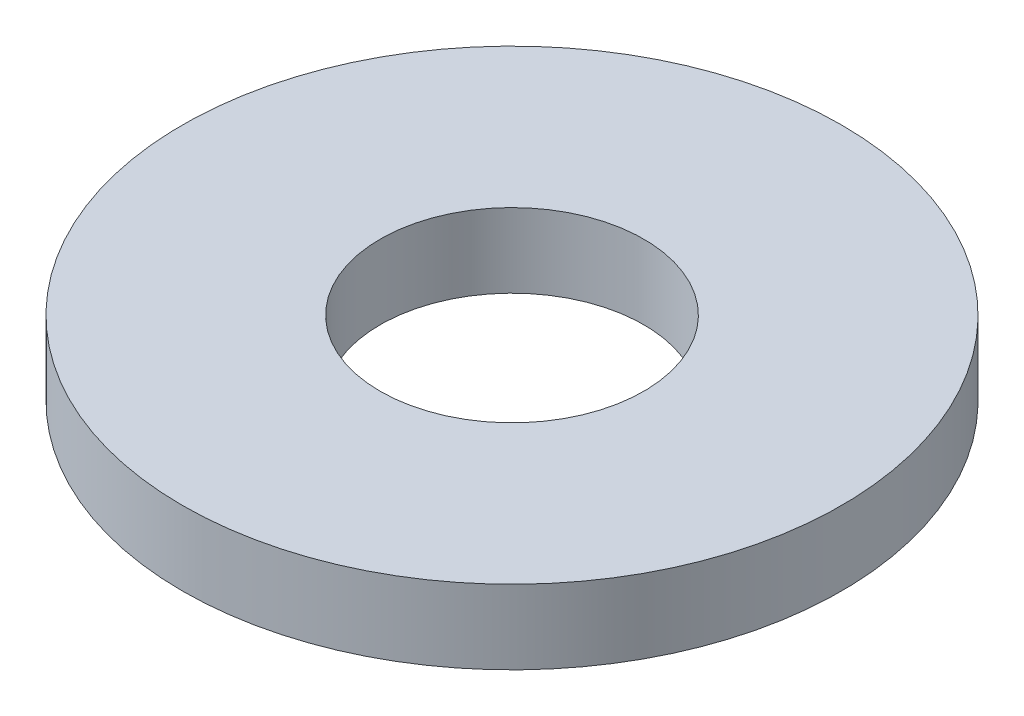
ISO-10303-21;
HEADER;
FILE_DESCRIPTION(('STEP AP214'),'2;1');
FILE_NAME('part.step','',(''),(''),'','','');
FILE_SCHEMA(('AUTOMOTIVE_DESIGN { 1 0 10303 214 1 1 1 1 }'));
ENDSEC;
DATA;
#1=APPLICATION_CONTEXT('core data for automotive mechanical design processes');
#2=APPLICATION_PROTOCOL_DEFINITION('international standard','automotive_design',2000,#1);
#3=PRODUCT_CONTEXT('',#1,'mechanical');
#4=PRODUCT('Part','Part','',(#3));
#5=PRODUCT_RELATED_PRODUCT_CATEGORY('part','',(#4));
#6=PRODUCT_DEFINITION_FORMATION('','',#4);
#7=PRODUCT_DEFINITION_CONTEXT('part definition',#1,'design');
#8=PRODUCT_DEFINITION('design','',#6,#7);
#9=PRODUCT_DEFINITION_SHAPE('','',#8);
#10=(LENGTH_UNIT() NAMED_UNIT(*) SI_UNIT(.MILLI.,.METRE.));
#11=(NAMED_UNIT(*) PLANE_ANGLE_UNIT() SI_UNIT($,.RADIAN.));
#12=(NAMED_UNIT(*) SI_UNIT($,.STERADIAN.) SOLID_ANGLE_UNIT());
#13=UNCERTAINTY_MEASURE_WITH_UNIT(LENGTH_MEASURE(1.E-05),#10,'distance_accuracy_value','');
#14=(GEOMETRIC_REPRESENTATION_CONTEXT(3) GLOBAL_UNCERTAINTY_ASSIGNED_CONTEXT((#13)) GLOBAL_UNIT_ASSIGNED_CONTEXT((#10,
#11,#12)) REPRESENTATION_CONTEXT('',''));
#15=CARTESIAN_POINT('',(0.,0.,0.));
#16=DIRECTION('',(0.,0.,1.));
#17=DIRECTION('',(1.,0.,0.));
#18=AXIS2_PLACEMENT_3D('',#15,#16,#17);
#19=CARTESIAN_POINT('',(0.,0.9,0.));
#20=DIRECTION('',(0.,-1.,0.));
#21=DIRECTION('',(0.,0.,-1.));
#22=AXIS2_PLACEMENT_3D('',#19,#20,#21);
#23=CYLINDRICAL_SURFACE('',#22,4.);
#24=CARTESIAN_POINT('',(0.,0.9,0.));
#25=DIRECTION('',(0.,1.,0.));
#26=DIRECTION('',(0.,0.,1.));
#27=AXIS2_PLACEMENT_3D('',#24,#25,#26);
#28=CIRCLE('',#27,4.);
#29=CARTESIAN_POINT('',(0.,0.9,4.));
#30=VERTEX_POINT('',#29);
#31=EDGE_CURVE('E10',#30,#30,#28,.T.);
#32=ORIENTED_EDGE('',*,*,#31,.F.);
#33=EDGE_LOOP('',(#32));
#34=FACE_BOUND('',#33,.T.);
#35=CARTESIAN_POINT('',(0.,0.,0.));
#36=DIRECTION('',(0.,1.,0.));
#37=DIRECTION('',(0.,0.,1.));
#38=AXIS2_PLACEMENT_3D('',#35,#36,#37);
#39=CIRCLE('',#38,4.);
#40=CARTESIAN_POINT('',(0.,0.,4.));
#41=VERTEX_POINT('',#40);
#42=EDGE_CURVE('E37',#41,#41,#39,.T.);
#43=ORIENTED_EDGE('',*,*,#42,.T.);
#44=EDGE_LOOP('',(#43));
#45=FACE_BOUND('',#44,.T.);
#46=ADVANCED_FACE('F34',(#34,#45),#23,.T.);
#47=CARTESIAN_POINT('',(0.,0.9,0.));
#48=DIRECTION('',(0.,1.,0.));
#49=DIRECTION('',(0.,0.,1.));
#50=AXIS2_PLACEMENT_3D('',#47,#48,#49);
#51=PLANE('',#50);
#52=CARTESIAN_POINT('',(0.,0.9,0.));
#53=DIRECTION('',(0.,1.,0.));
#54=DIRECTION('',(0.,0.,1.));
#55=AXIS2_PLACEMENT_3D('',#52,#53,#54);
#56=CIRCLE('',#55,1.6);
#57=CARTESIAN_POINT('',(0.,0.9,1.6));
#58=VERTEX_POINT('',#57);
#59=EDGE_CURVE('E46',#58,#58,#56,.T.);
#60=ORIENTED_EDGE('',*,*,#59,.F.);
#61=EDGE_LOOP('',(#60));
#62=FACE_BOUND('',#61,.T.);
#63=ORIENTED_EDGE('',*,*,#31,.T.);
#64=EDGE_LOOP('',(#63));
#65=FACE_BOUND('',#64,.T.);
#66=ADVANCED_FACE('F61',(#62,#65),#51,.T.);
#67=CARTESIAN_POINT('',(0.,0.,0.));
#68=DIRECTION('',(0.,1.,0.));
#69=DIRECTION('',(0.,0.,1.));
#70=AXIS2_PLACEMENT_3D('',#67,#68,#69);
#71=PLANE('',#70);
#72=CARTESIAN_POINT('',(0.,0.,0.));
#73=DIRECTION('',(0.,1.,0.));
#74=DIRECTION('',(0.,0.,1.));
#75=AXIS2_PLACEMENT_3D('',#72,#73,#74);
#76=CIRCLE('',#75,1.6);
#77=CARTESIAN_POINT('',(0.,0.,1.6));
#78=VERTEX_POINT('',#77);
#79=EDGE_CURVE('E44',#78,#78,#76,.T.);
#80=ORIENTED_EDGE('',*,*,#79,.T.);
#81=EDGE_LOOP('',(#80));
#82=FACE_BOUND('',#81,.T.);
#83=ORIENTED_EDGE('',*,*,#42,.F.);
#84=EDGE_LOOP('',(#83));
#85=FACE_BOUND('',#84,.T.);
#86=ADVANCED_FACE('F52',(#82,#85),#71,.F.);
#87=CARTESIAN_POINT('',(0.,0.,0.));
#88=DIRECTION('',(0.,1.,0.));
#89=DIRECTION('',(0.,0.,1.));
#90=AXIS2_PLACEMENT_3D('',#87,#88,#89);
#91=CYLINDRICAL_SURFACE('',#90,1.6);
#92=ORIENTED_EDGE('',*,*,#79,.F.);
#93=EDGE_LOOP('',(#92));
#94=FACE_BOUND('',#93,.T.);
#95=ORIENTED_EDGE('',*,*,#59,.T.);
#96=EDGE_LOOP('',(#95));
#97=FACE_BOUND('',#96,.T.);
#98=ADVANCED_FACE('F55',(#94,#97),#91,.F.);
#99=CLOSED_SHELL('',(#46,#66,#86,#98));
#100=MANIFOLD_SOLID_BREP('B2',#99);
#101=ADVANCED_BREP_SHAPE_REPRESENTATION('',(#18,#100),#14);
#102=SHAPE_DEFINITION_REPRESENTATION(#9,#101);
ENDSEC;
END-ISO-10303-21;
